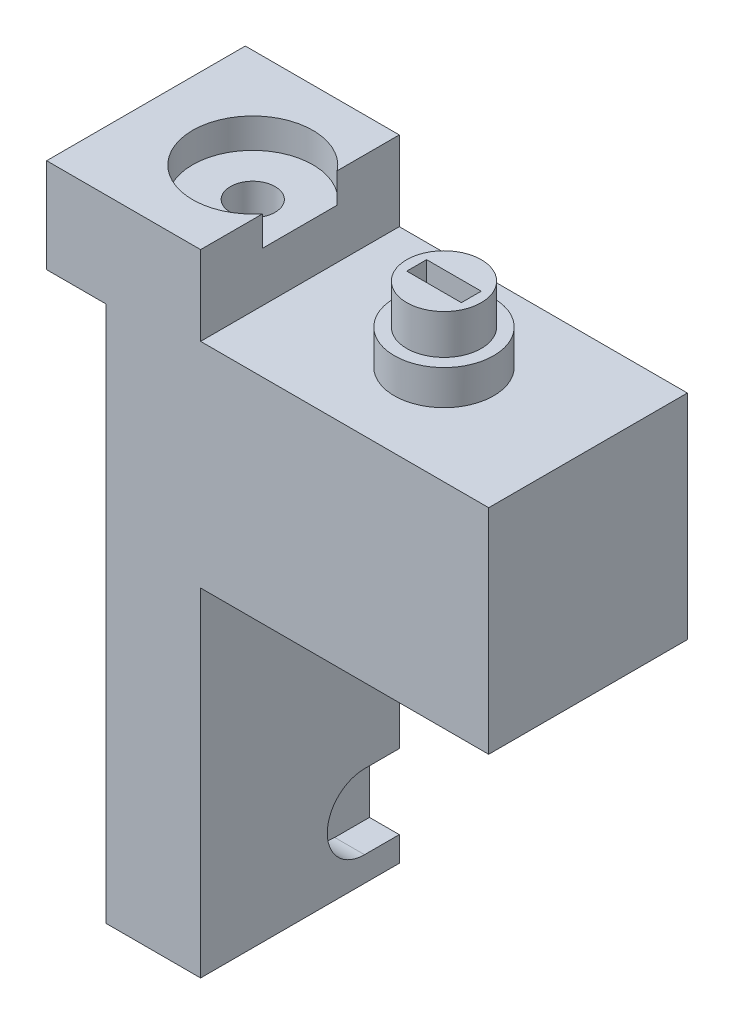
ISO-10303-21;
HEADER;
FILE_DESCRIPTION(('STEP AP214'),'2;1');
FILE_NAME('part.step','',(''),(''),'','','');
FILE_SCHEMA(('AUTOMOTIVE_DESIGN { 1 0 10303 214 1 1 1 1 }'));
ENDSEC;
DATA;
#1=APPLICATION_CONTEXT('core data for automotive mechanical design processes');
#2=APPLICATION_PROTOCOL_DEFINITION('international standard','automotive_design',2000,#1);
#3=PRODUCT_CONTEXT('',#1,'mechanical');
#4=PRODUCT('Part','Part','',(#3));
#5=PRODUCT_RELATED_PRODUCT_CATEGORY('part','',(#4));
#6=PRODUCT_DEFINITION_FORMATION('','',#4);
#7=PRODUCT_DEFINITION_CONTEXT('part definition',#1,'design');
#8=PRODUCT_DEFINITION('design','',#6,#7);
#9=PRODUCT_DEFINITION_SHAPE('','',#8);
#10=(LENGTH_UNIT() NAMED_UNIT(*) SI_UNIT(.MILLI.,.METRE.));
#11=(NAMED_UNIT(*) PLANE_ANGLE_UNIT() SI_UNIT($,.RADIAN.));
#12=(NAMED_UNIT(*) SI_UNIT($,.STERADIAN.) SOLID_ANGLE_UNIT());
#13=UNCERTAINTY_MEASURE_WITH_UNIT(LENGTH_MEASURE(1.E-05),#10,'distance_accuracy_value','');
#14=(GEOMETRIC_REPRESENTATION_CONTEXT(3) GLOBAL_UNCERTAINTY_ASSIGNED_CONTEXT((#13)) GLOBAL_UNIT_ASSIGNED_CONTEXT((#10,
#11,#12)) REPRESENTATION_CONTEXT('',''));
#15=CARTESIAN_POINT('',(0.,0.,0.));
#16=DIRECTION('',(0.,0.,1.));
#17=DIRECTION('',(1.,0.,0.));
#18=AXIS2_PLACEMENT_3D('',#15,#16,#17);
#19=CARTESIAN_POINT('',(12.192,29.972,-5.08));
#20=DIRECTION('',(0.,1.,0.));
#21=DIRECTION('',(0.,0.,1.));
#22=AXIS2_PLACEMENT_3D('',#19,#20,#21);
#23=PLANE('',#22);
#24=CARTESIAN_POINT('',(12.192,29.972,-5.08));
#25=DIRECTION('',(0.,1.,0.));
#26=DIRECTION('',(0.,0.,1.));
#27=AXIS2_PLACEMENT_3D('',#24,#25,#26);
#28=CIRCLE('',#27,2.54);
#29=CARTESIAN_POINT('',(12.192,29.972,-2.54));
#30=VERTEX_POINT('',#29);
#31=EDGE_CURVE('E213',#30,#30,#28,.T.);
#32=ORIENTED_EDGE('',*,*,#31,.T.);
#33=EDGE_LOOP('',(#32));
#34=FACE_BOUND('',#33,.T.);
#35=CARTESIAN_POINT('',(12.192,29.972,-5.08));
#36=DIRECTION('',(0.,1.,0.));
#37=DIRECTION('',(0.,0.,1.));
#38=AXIS2_PLACEMENT_3D('',#35,#36,#37);
#39=CIRCLE('',#38,1.905);
#40=CARTESIAN_POINT('',(12.192,29.972,-3.175));
#41=VERTEX_POINT('',#40);
#42=EDGE_CURVE('E206',#41,#41,#39,.T.);
#43=ORIENTED_EDGE('',*,*,#42,.F.);
#44=EDGE_LOOP('',(#43));
#45=FACE_BOUND('',#44,.T.);
#46=ADVANCED_FACE('F34',(#34,#45),#23,.T.);
#47=CARTESIAN_POINT('',(0.,28.194,-10.16));
#48=DIRECTION('',(0.,-1.,0.));
#49=DIRECTION('',(0.,0.,-1.));
#50=AXIS2_PLACEMENT_3D('',#47,#48,#49);
#51=PLANE('',#50);
#52=DIRECTION('',(1.,0.,0.));
#53=VECTOR('',#52,1.);
#54=CARTESIAN_POINT('',(0.,28.194,0.));
#55=LINE('',#54,#53);
#56=CARTESIAN_POINT('',(4.826,28.194,0.));
#57=VERTEX_POINT('',#56);
#58=CARTESIAN_POINT('',(19.558,28.194,0.));
#59=VERTEX_POINT('',#58);
#60=EDGE_CURVE('E299',#57,#59,#55,.T.);
#61=ORIENTED_EDGE('',*,*,#60,.T.);
#62=DIRECTION('',(0.,0.,1.));
#63=VECTOR('',#62,1.);
#64=CARTESIAN_POINT('',(19.558,28.194,-10.16));
#65=LINE('',#64,#63);
#66=CARTESIAN_POINT('',(19.558,28.194,-10.16));
#67=VERTEX_POINT('',#66);
#68=EDGE_CURVE('E337',#67,#59,#65,.T.);
#69=ORIENTED_EDGE('',*,*,#68,.F.);
#70=DIRECTION('',(1.,0.,0.));
#71=VECTOR('',#70,1.);
#72=CARTESIAN_POINT('',(0.,28.194,-10.16));
#73=LINE('',#72,#71);
#74=CARTESIAN_POINT('',(4.826,28.194,-10.16));
#75=VERTEX_POINT('',#74);
#76=EDGE_CURVE('E272',#75,#67,#73,.T.);
#77=ORIENTED_EDGE('',*,*,#76,.F.);
#78=DIRECTION('',(0.,0.,1.));
#79=VECTOR('',#78,1.);
#80=CARTESIAN_POINT('',(4.826,28.194,-10.16));
#81=LINE('',#80,#79);
#82=EDGE_CURVE('E335',#75,#57,#81,.T.);
#83=ORIENTED_EDGE('',*,*,#82,.T.);
#84=EDGE_LOOP('',(#61,#69,#77,#83));
#85=FACE_BOUND('',#84,.T.);
#86=CARTESIAN_POINT('',(12.192,28.194,-5.08));
#87=DIRECTION('',(0.,-1.,0.));
#88=DIRECTION('',(0.,0.,-1.));
#89=AXIS2_PLACEMENT_3D('',#86,#87,#88);
#90=CIRCLE('',#89,2.54);
#91=CARTESIAN_POINT('',(12.192,28.194,-7.62));
#92=VERTEX_POINT('',#91);
#93=EDGE_CURVE('E11',#92,#92,#90,.F.);
#94=ORIENTED_EDGE('',*,*,#93,.F.);
#95=EDGE_LOOP('',(#94));
#96=FACE_BOUND('',#95,.T.);
#97=ADVANCED_FACE('F393',(#85,#96),#51,.F.);
#98=CARTESIAN_POINT('',(2.413,32.258,-5.08));
#99=DIRECTION('',(0.,-1.,0.));
#100=DIRECTION('',(0.,0.,-1.));
#101=AXIS2_PLACEMENT_3D('',#98,#99,#100);
#102=CYLINDRICAL_SURFACE('',#101,1.143);
#103=CARTESIAN_POINT('',(2.413,0.,-5.08));
#104=DIRECTION('',(0.,-1.,0.));
#105=DIRECTION('',(0.,0.,-1.));
#106=AXIS2_PLACEMENT_3D('',#103,#104,#105);
#107=CIRCLE('',#106,1.143);
#108=CARTESIAN_POINT('',(2.413,0.,-6.223));
#109=VERTEX_POINT('',#108);
#110=EDGE_CURVE('E261',#109,#109,#107,.T.);
#111=ORIENTED_EDGE('',*,*,#110,.T.);
#112=EDGE_LOOP('',(#111));
#113=FACE_BOUND('',#112,.T.);
#114=CARTESIAN_POINT('',(2.413,30.734,-5.08));
#115=DIRECTION('',(0.,1.,0.));
#116=DIRECTION('',(0.,0.,1.));
#117=AXIS2_PLACEMENT_3D('',#114,#115,#116);
#118=CIRCLE('',#117,1.143);
#119=CARTESIAN_POINT('',(2.413,30.734,-3.937));
#120=VERTEX_POINT('',#119);
#121=EDGE_CURVE('E219',#120,#120,#118,.F.);
#122=ORIENTED_EDGE('',*,*,#121,.F.);
#123=EDGE_LOOP('',(#122));
#124=FACE_BOUND('',#123,.T.);
#125=ADVANCED_FACE('F399',(#113,#124),#102,.F.);
#126=CARTESIAN_POINT('',(4.826,0.,-10.16));
#127=DIRECTION('',(1.,0.,0.));
#128=DIRECTION('',(0.,0.,-1.));
#129=AXIS2_PLACEMENT_3D('',#126,#127,#128);
#130=PLANE('',#129);
#131=DIRECTION('',(0.,1.,0.));
#132=VECTOR('',#131,1.);
#133=CARTESIAN_POINT('',(4.826,0.,-10.16));
#134=LINE('',#133,#132);
#135=CARTESIAN_POINT('',(4.826,0.,-10.16));
#136=VERTEX_POINT('',#135);
#137=CARTESIAN_POINT('',(4.826,1.27,-10.16));
#138=VERTEX_POINT('',#137);
#139=EDGE_CURVE('E279',#136,#138,#134,.T.);
#140=ORIENTED_EDGE('',*,*,#139,.T.);
#141=DIRECTION('',(0.,0.,1.));
#142=VECTOR('',#141,1.);
#143=CARTESIAN_POINT('',(4.826,1.27,-10.16));
#144=LINE('',#143,#142);
#145=CARTESIAN_POINT('',(4.826,1.27,-8.382));
#146=VERTEX_POINT('',#145);
#147=EDGE_CURVE('E230',#138,#146,#144,.T.);
#148=ORIENTED_EDGE('',*,*,#147,.T.);
#149=CARTESIAN_POINT('',(4.826,3.175,-8.382));
#150=DIRECTION('',(-1.,0.,0.));
#151=DIRECTION('',(0.,0.,1.));
#152=AXIS2_PLACEMENT_3D('',#149,#150,#151);
#153=CIRCLE('',#152,1.905);
#154=CARTESIAN_POINT('',(4.826,5.08,-8.382));
#155=VERTEX_POINT('',#154);
#156=EDGE_CURVE('E247',#146,#155,#153,.T.);
#157=ORIENTED_EDGE('',*,*,#156,.T.);
#158=DIRECTION('',(0.,0.,1.));
#159=VECTOR('',#158,1.);
#160=CARTESIAN_POINT('',(4.826,5.08,-10.16));
#161=LINE('',#160,#159);
#162=CARTESIAN_POINT('',(4.826,5.08,-10.16));
#163=VERTEX_POINT('',#162);
#164=EDGE_CURVE('E236',#163,#155,#161,.T.);
#165=ORIENTED_EDGE('',*,*,#164,.F.);
#166=CARTESIAN_POINT('',(4.826,17.272,-10.16));
#167=VERTEX_POINT('',#166);
#168=EDGE_CURVE('E278',#163,#167,#134,.T.);
#169=ORIENTED_EDGE('',*,*,#168,.T.);
#170=DIRECTION('',(0.,0.,1.));
#171=VECTOR('',#170,1.);
#172=CARTESIAN_POINT('',(4.826,17.272,-10.16));
#173=LINE('',#172,#171);
#174=CARTESIAN_POINT('',(4.826,17.272,0.));
#175=VERTEX_POINT('',#174);
#176=EDGE_CURVE('E42',#167,#175,#173,.T.);
#177=ORIENTED_EDGE('',*,*,#176,.T.);
#178=DIRECTION('',(0.,1.,0.));
#179=VECTOR('',#178,1.);
#180=CARTESIAN_POINT('',(4.826,0.,0.));
#181=LINE('',#180,#179);
#182=CARTESIAN_POINT('',(4.826,0.,0.));
#183=VERTEX_POINT('',#182);
#184=EDGE_CURVE('E269',#183,#175,#181,.T.);
#185=ORIENTED_EDGE('',*,*,#184,.F.);
#186=DIRECTION('',(0.,0.,1.));
#187=VECTOR('',#186,1.);
#188=CARTESIAN_POINT('',(4.826,0.,-10.16));
#189=LINE('',#188,#187);
#190=EDGE_CURVE('E321',#136,#183,#189,.T.);
#191=ORIENTED_EDGE('',*,*,#190,.F.);
#192=EDGE_LOOP('',(#140,#148,#157,#165,#169,#177,#185,#191));
#193=FACE_BOUND('',#192,.T.);
#194=ADVANCED_FACE('F348',(#193),#130,.T.);
#195=CARTESIAN_POINT('',(0.,0.,-10.16));
#196=DIRECTION('',(0.,0.,1.));
#197=DIRECTION('',(1.,0.,0.));
#198=AXIS2_PLACEMENT_3D('',#195,#196,#197);
#199=PLANE('',#198);
#200=DIRECTION('',(1.,0.,0.));
#201=VECTOR('',#200,1.);
#202=CARTESIAN_POINT('',(3.302,1.27,-10.16));
#203=LINE('',#202,#201);
#204=CARTESIAN_POINT('',(3.302,1.27,-10.16));
#205=VERTEX_POINT('',#204);
#206=EDGE_CURVE('E244',#205,#138,#203,.T.);
#207=ORIENTED_EDGE('',*,*,#206,.T.);
#208=ORIENTED_EDGE('',*,*,#139,.F.);
#209=DIRECTION('',(1.,0.,0.));
#210=VECTOR('',#209,1.);
#211=CARTESIAN_POINT('',(0.,0.,-10.16));
#212=LINE('',#211,#210);
#213=CARTESIAN_POINT('',(0.,0.,-10.16));
#214=VERTEX_POINT('',#213);
#215=EDGE_CURVE('E291',#214,#136,#212,.T.);
#216=ORIENTED_EDGE('',*,*,#215,.F.);
#217=DIRECTION('',(0.,-1.,0.));
#218=VECTOR('',#217,1.);
#219=CARTESIAN_POINT('',(0.,0.,-10.16));
#220=LINE('',#219,#218);
#221=CARTESIAN_POINT('',(0.,27.432,-10.16));
#222=VERTEX_POINT('',#221);
#223=EDGE_CURVE('E288',#222,#214,#220,.T.);
#224=ORIENTED_EDGE('',*,*,#223,.F.);
#225=DIRECTION('',(1.,0.,0.));
#226=VECTOR('',#225,1.);
#227=CARTESIAN_POINT('',(0.,27.432,-10.16));
#228=LINE('',#227,#226);
#229=CARTESIAN_POINT('',(-3.048,27.432,-10.16));
#230=VERTEX_POINT('',#229);
#231=EDGE_CURVE('E285',#230,#222,#228,.T.);
#232=ORIENTED_EDGE('',*,*,#231,.F.);
#233=DIRECTION('',(0.,-1.,0.));
#234=VECTOR('',#233,1.);
#235=CARTESIAN_POINT('',(-3.04799999999999,0.,-10.16));
#236=LINE('',#235,#234);
#237=CARTESIAN_POINT('',(-3.048,32.258,-10.16));
#238=VERTEX_POINT('',#237);
#239=EDGE_CURVE('E282',#238,#230,#236,.T.);
#240=ORIENTED_EDGE('',*,*,#239,.F.);
#241=DIRECTION('',(-1.,0.,0.));
#242=VECTOR('',#241,1.);
#243=CARTESIAN_POINT('',(0.,32.258,-10.16));
#244=LINE('',#243,#242);
#245=CARTESIAN_POINT('',(4.826,32.258,-10.16));
#246=VERTEX_POINT('',#245);
#247=EDGE_CURVE('E277',#246,#238,#244,.T.);
#248=ORIENTED_EDGE('',*,*,#247,.F.);
#249=EDGE_CURVE('E274',#75,#246,#134,.T.);
#250=ORIENTED_EDGE('',*,*,#249,.F.);
#251=ORIENTED_EDGE('',*,*,#76,.T.);
#252=DIRECTION('',(0.,1.,0.));
#253=VECTOR('',#252,1.);
#254=CARTESIAN_POINT('',(19.558,0.,-10.16));
#255=LINE('',#254,#253);
#256=CARTESIAN_POINT('',(19.558,17.272,-10.16));
#257=VERTEX_POINT('',#256);
#258=EDGE_CURVE('E268',#257,#67,#255,.T.);
#259=ORIENTED_EDGE('',*,*,#258,.F.);
#260=DIRECTION('',(1.,0.,0.));
#261=VECTOR('',#260,1.);
#262=CARTESIAN_POINT('',(0.,17.272,-10.16));
#263=LINE('',#262,#261);
#264=EDGE_CURVE('E265',#167,#257,#263,.T.);
#265=ORIENTED_EDGE('',*,*,#264,.F.);
#266=ORIENTED_EDGE('',*,*,#168,.F.);
#267=DIRECTION('',(1.,0.,0.));
#268=VECTOR('',#267,1.);
#269=CARTESIAN_POINT('',(3.302,5.08,-10.16));
#270=LINE('',#269,#268);
#271=CARTESIAN_POINT('',(3.302,5.08,-10.16));
#272=VERTEX_POINT('',#271);
#273=EDGE_CURVE('E254',#272,#163,#270,.T.);
#274=ORIENTED_EDGE('',*,*,#273,.F.);
#275=DIRECTION('',(0.,1.,0.));
#276=VECTOR('',#275,1.);
#277=CARTESIAN_POINT('',(3.302,1.27,-10.16));
#278=LINE('',#277,#276);
#279=EDGE_CURVE('E241',#205,#272,#278,.T.);
#280=ORIENTED_EDGE('',*,*,#279,.F.);
#281=EDGE_LOOP('',(#207,#208,#216,#224,#232,#240,#248,#250,#251,#259,#265,#266,#274,#280));
#282=FACE_BOUND('',#281,.T.);
#283=ADVANCED_FACE('F355',(#282),#199,.F.);
#284=CARTESIAN_POINT('',(0.,17.272,-10.16));
#285=DIRECTION('',(0.,-1.,0.));
#286=DIRECTION('',(0.,0.,-1.));
#287=AXIS2_PLACEMENT_3D('',#284,#285,#286);
#288=PLANE('',#287);
#289=DIRECTION('',(1.,0.,0.));
#290=VECTOR('',#289,1.);
#291=CARTESIAN_POINT('',(0.,17.272,0.));
#292=LINE('',#291,#290);
#293=CARTESIAN_POINT('',(19.558,17.272,0.));
#294=VERTEX_POINT('',#293);
#295=EDGE_CURVE('E264',#175,#294,#292,.T.);
#296=ORIENTED_EDGE('',*,*,#295,.F.);
#297=ORIENTED_EDGE('',*,*,#176,.F.);
#298=ORIENTED_EDGE('',*,*,#264,.T.);
#299=DIRECTION('',(0.,0.,1.));
#300=VECTOR('',#299,1.);
#301=CARTESIAN_POINT('',(19.558,17.272,-10.16));
#302=LINE('',#301,#300);
#303=EDGE_CURVE('E338',#257,#294,#302,.T.);
#304=ORIENTED_EDGE('',*,*,#303,.T.);
#305=EDGE_LOOP('',(#296,#297,#298,#304));
#306=FACE_BOUND('',#305,.T.);
#307=ADVANCED_FACE('F36',(#306),#288,.T.);
#308=CARTESIAN_POINT('',(0.,0.,-10.16));
#309=DIRECTION('',(0.,-1.,0.));
#310=DIRECTION('',(0.,0.,-1.));
#311=AXIS2_PLACEMENT_3D('',#308,#309,#310);
#312=PLANE('',#311);
#313=ORIENTED_EDGE('',*,*,#110,.F.);
#314=EDGE_LOOP('',(#313));
#315=FACE_BOUND('',#314,.T.);
#316=DIRECTION('',(1.,0.,0.));
#317=VECTOR('',#316,1.);
#318=CARTESIAN_POINT('',(0.,0.,0.));
#319=LINE('',#318,#317);
#320=CARTESIAN_POINT('',(0.,0.,0.));
#321=VERTEX_POINT('',#320);
#322=EDGE_CURVE('E317',#321,#183,#319,.T.);
#323=ORIENTED_EDGE('',*,*,#322,.F.);
#324=DIRECTION('',(0.,0.,1.));
#325=VECTOR('',#324,1.);
#326=CARTESIAN_POINT('',(0.,0.,-10.16));
#327=LINE('',#326,#325);
#328=EDGE_CURVE('E323',#214,#321,#327,.T.);
#329=ORIENTED_EDGE('',*,*,#328,.F.);
#330=ORIENTED_EDGE('',*,*,#215,.T.);
#331=ORIENTED_EDGE('',*,*,#190,.T.);
#332=EDGE_LOOP('',(#323,#329,#330,#331));
#333=FACE_BOUND('',#332,.T.);
#334=ADVANCED_FACE('F367',(#315,#333),#312,.T.);
#335=CARTESIAN_POINT('',(0.,0.,-10.16));
#336=DIRECTION('',(-1.,0.,0.));
#337=DIRECTION('',(0.,0.,1.));
#338=AXIS2_PLACEMENT_3D('',#335,#336,#337);
#339=PLANE('',#338);
#340=DIRECTION('',(0.,-1.,0.));
#341=VECTOR('',#340,1.);
#342=CARTESIAN_POINT('',(0.,0.,0.));
#343=LINE('',#342,#341);
#344=CARTESIAN_POINT('',(0.,27.432,0.));
#345=VERTEX_POINT('',#344);
#346=EDGE_CURVE('E314',#345,#321,#343,.T.);
#347=ORIENTED_EDGE('',*,*,#346,.F.);
#348=DIRECTION('',(0.,0.,1.));
#349=VECTOR('',#348,1.);
#350=CARTESIAN_POINT('',(0.,27.432,-10.16));
#351=LINE('',#350,#349);
#352=EDGE_CURVE('E325',#222,#345,#351,.T.);
#353=ORIENTED_EDGE('',*,*,#352,.F.);
#354=ORIENTED_EDGE('',*,*,#223,.T.);
#355=ORIENTED_EDGE('',*,*,#328,.T.);
#356=EDGE_LOOP('',(#347,#353,#354,#355));
#357=FACE_BOUND('',#356,.T.);
#358=ADVANCED_FACE('F440',(#357),#339,.T.);
#359=CARTESIAN_POINT('',(0.,27.432,-10.16));
#360=DIRECTION('',(0.,-1.,0.));
#361=DIRECTION('',(0.,0.,-1.));
#362=AXIS2_PLACEMENT_3D('',#359,#360,#361);
#363=PLANE('',#362);
#364=DIRECTION('',(1.,0.,0.));
#365=VECTOR('',#364,1.);
#366=CARTESIAN_POINT('',(0.,27.432,0.));
#367=LINE('',#366,#365);
#368=CARTESIAN_POINT('',(-3.048,27.432,0.));
#369=VERTEX_POINT('',#368);
#370=EDGE_CURVE('E311',#369,#345,#367,.T.);
#371=ORIENTED_EDGE('',*,*,#370,.F.);
#372=DIRECTION('',(0.,0.,1.));
#373=VECTOR('',#372,1.);
#374=CARTESIAN_POINT('',(-3.048,27.432,-10.16));
#375=LINE('',#374,#373);
#376=EDGE_CURVE('E327',#230,#369,#375,.T.);
#377=ORIENTED_EDGE('',*,*,#376,.F.);
#378=ORIENTED_EDGE('',*,*,#231,.T.);
#379=ORIENTED_EDGE('',*,*,#352,.T.);
#380=EDGE_LOOP('',(#371,#377,#378,#379));
#381=FACE_BOUND('',#380,.T.);
#382=ADVANCED_FACE('F438',(#381),#363,.T.);
#383=CARTESIAN_POINT('',(-3.04799999999999,0.,-10.16));
#384=DIRECTION('',(-1.,0.,0.));
#385=DIRECTION('',(0.,-1.,0.));
#386=AXIS2_PLACEMENT_3D('',#383,#384,#385);
#387=PLANE('',#386);
#388=DIRECTION('',(0.,-1.,0.));
#389=VECTOR('',#388,1.);
#390=CARTESIAN_POINT('',(-3.04799999999999,0.,0.));
#391=LINE('',#390,#389);
#392=CARTESIAN_POINT('',(-3.048,32.258,0.));
#393=VERTEX_POINT('',#392);
#394=EDGE_CURVE('E308',#393,#369,#391,.T.);
#395=ORIENTED_EDGE('',*,*,#394,.F.);
#396=DIRECTION('',(0.,0.,1.));
#397=VECTOR('',#396,1.);
#398=CARTESIAN_POINT('',(-3.048,32.258,-10.16));
#399=LINE('',#398,#397);
#400=EDGE_CURVE('E329',#238,#393,#399,.T.);
#401=ORIENTED_EDGE('',*,*,#400,.F.);
#402=ORIENTED_EDGE('',*,*,#239,.T.);
#403=ORIENTED_EDGE('',*,*,#376,.T.);
#404=EDGE_LOOP('',(#395,#401,#402,#403));
#405=FACE_BOUND('',#404,.T.);
#406=ADVANCED_FACE('F429',(#405),#387,.T.);
#407=CARTESIAN_POINT('',(0.,32.258,-10.16));
#408=DIRECTION('',(0.,1.,0.));
#409=DIRECTION('',(0.,0.,1.));
#410=AXIS2_PLACEMENT_3D('',#407,#408,#409);
#411=PLANE('',#410);
#412=CARTESIAN_POINT('',(2.413,32.258,-5.08));
#413=DIRECTION('',(0.,1.,0.));
#414=DIRECTION('',(0.,0.,1.));
#415=AXIS2_PLACEMENT_3D('',#412,#413,#414);
#416=CIRCLE('',#415,3.07434448297519);
#417=CARTESIAN_POINT('',(4.826,32.258,-6.985));
#418=VERTEX_POINT('',#417);
#419=CARTESIAN_POINT('',(4.826,32.258,-3.175));
#420=VERTEX_POINT('',#419);
#421=EDGE_CURVE('E218',#418,#420,#416,.T.);
#422=ORIENTED_EDGE('',*,*,#421,.F.);
#423=DIRECTION('',(0.,0.,1.));
#424=VECTOR('',#423,1.);
#425=CARTESIAN_POINT('',(4.826,32.258,-10.16));
#426=LINE('',#425,#424);
#427=EDGE_CURVE('E331',#246,#418,#426,.T.);
#428=ORIENTED_EDGE('',*,*,#427,.F.);
#429=ORIENTED_EDGE('',*,*,#247,.T.);
#430=ORIENTED_EDGE('',*,*,#400,.T.);
#431=DIRECTION('',(-1.,0.,0.));
#432=VECTOR('',#431,1.);
#433=CARTESIAN_POINT('',(0.,32.258,0.));
#434=LINE('',#433,#432);
#435=CARTESIAN_POINT('',(4.826,32.258,0.));
#436=VERTEX_POINT('',#435);
#437=EDGE_CURVE('E305',#436,#393,#434,.T.);
#438=ORIENTED_EDGE('',*,*,#437,.F.);
#439=EDGE_CURVE('E334',#420,#436,#426,.T.);
#440=ORIENTED_EDGE('',*,*,#439,.F.);
#441=EDGE_LOOP('',(#422,#428,#429,#430,#438,#440));
#442=FACE_BOUND('',#441,.T.);
#443=ADVANCED_FACE('F423',(#442),#411,.T.);
#444=DIRECTION('',(0.,1.,0.));
#445=VECTOR('',#444,1.);
#446=CARTESIAN_POINT('',(4.826,30.734,-6.985));
#447=LINE('',#446,#445);
#448=CARTESIAN_POINT('',(4.826,30.734,-6.985));
#449=VERTEX_POINT('',#448);
#450=EDGE_CURVE('E225',#449,#418,#447,.T.);
#451=ORIENTED_EDGE('',*,*,#450,.F.);
#452=DIRECTION('',(0.,0.,-1.));
#453=VECTOR('',#452,1.);
#454=CARTESIAN_POINT('',(4.826,30.734,0.));
#455=LINE('',#454,#453);
#456=CARTESIAN_POINT('',(4.826,30.734,-3.175));
#457=VERTEX_POINT('',#456);
#458=EDGE_CURVE('E222',#457,#449,#455,.T.);
#459=ORIENTED_EDGE('',*,*,#458,.F.);
#460=DIRECTION('',(0.,1.,0.));
#461=VECTOR('',#460,1.);
#462=CARTESIAN_POINT('',(4.826,30.734,-3.175));
#463=LINE('',#462,#461);
#464=EDGE_CURVE('E227',#457,#420,#463,.T.);
#465=ORIENTED_EDGE('',*,*,#464,.T.);
#466=ORIENTED_EDGE('',*,*,#439,.T.);
#467=EDGE_CURVE('E302',#57,#436,#181,.T.);
#468=ORIENTED_EDGE('',*,*,#467,.F.);
#469=ORIENTED_EDGE('',*,*,#82,.F.);
#470=ORIENTED_EDGE('',*,*,#249,.T.);
#471=ORIENTED_EDGE('',*,*,#427,.T.);
#472=EDGE_LOOP('',(#451,#459,#465,#466,#468,#469,#470,#471));
#473=FACE_BOUND('',#472,.T.);
#474=ADVANCED_FACE('F420',(#473),#130,.T.);
#475=CARTESIAN_POINT('',(19.558,0.,-10.16));
#476=DIRECTION('',(1.,0.,0.));
#477=DIRECTION('',(0.,0.,-1.));
#478=AXIS2_PLACEMENT_3D('',#475,#476,#477);
#479=PLANE('',#478);
#480=DIRECTION('',(0.,1.,0.));
#481=VECTOR('',#480,1.);
#482=CARTESIAN_POINT('',(19.558,0.,0.));
#483=LINE('',#482,#481);
#484=EDGE_CURVE('E296',#294,#59,#483,.T.);
#485=ORIENTED_EDGE('',*,*,#484,.F.);
#486=ORIENTED_EDGE('',*,*,#303,.F.);
#487=ORIENTED_EDGE('',*,*,#258,.T.);
#488=ORIENTED_EDGE('',*,*,#68,.T.);
#489=EDGE_LOOP('',(#485,#486,#487,#488));
#490=FACE_BOUND('',#489,.T.);
#491=ADVANCED_FACE('F360',(#490),#479,.T.);
#492=CARTESIAN_POINT('',(0.,0.,0.));
#493=DIRECTION('',(0.,0.,1.));
#494=DIRECTION('',(1.,0.,0.));
#495=AXIS2_PLACEMENT_3D('',#492,#493,#494);
#496=PLANE('',#495);
#497=ORIENTED_EDGE('',*,*,#295,.T.);
#498=ORIENTED_EDGE('',*,*,#484,.T.);
#499=ORIENTED_EDGE('',*,*,#60,.F.);
#500=ORIENTED_EDGE('',*,*,#467,.T.);
#501=ORIENTED_EDGE('',*,*,#437,.T.);
#502=ORIENTED_EDGE('',*,*,#394,.T.);
#503=ORIENTED_EDGE('',*,*,#370,.T.);
#504=ORIENTED_EDGE('',*,*,#346,.T.);
#505=ORIENTED_EDGE('',*,*,#322,.T.);
#506=ORIENTED_EDGE('',*,*,#184,.T.);
#507=EDGE_LOOP('',(#497,#498,#499,#500,#501,#502,#503,#504,#505,#506));
#508=FACE_BOUND('',#507,.T.);
#509=ADVANCED_FACE('F363',(#508),#496,.T.);
#510=CARTESIAN_POINT('',(3.302,1.27,-10.16));
#511=DIRECTION('',(0.,1.,0.));
#512=DIRECTION('',(0.,0.,1.));
#513=AXIS2_PLACEMENT_3D('',#510,#511,#512);
#514=PLANE('',#513);
#515=ORIENTED_EDGE('',*,*,#147,.F.);
#516=ORIENTED_EDGE('',*,*,#206,.F.);
#517=DIRECTION('',(0.,0.,1.));
#518=VECTOR('',#517,1.);
#519=CARTESIAN_POINT('',(3.302,1.27,-10.16));
#520=LINE('',#519,#518);
#521=CARTESIAN_POINT('',(3.302,1.27,-8.382));
#522=VERTEX_POINT('',#521);
#523=EDGE_CURVE('E232',#205,#522,#520,.T.);
#524=ORIENTED_EDGE('',*,*,#523,.T.);
#525=DIRECTION('',(1.,0.,0.));
#526=VECTOR('',#525,1.);
#527=CARTESIAN_POINT('',(3.302,1.27,-8.382));
#528=LINE('',#527,#526);
#529=EDGE_CURVE('E258',#522,#146,#528,.T.);
#530=ORIENTED_EDGE('',*,*,#529,.T.);
#531=EDGE_LOOP('',(#515,#516,#524,#530));
#532=FACE_BOUND('',#531,.T.);
#533=ADVANCED_FACE('F372',(#532),#514,.T.);
#534=CARTESIAN_POINT('',(3.302,3.175,-8.382));
#535=DIRECTION('',(1.,0.,0.));
#536=DIRECTION('',(0.,0.,-1.));
#537=AXIS2_PLACEMENT_3D('',#534,#535,#536);
#538=CYLINDRICAL_SURFACE('',#537,1.905);
#539=ORIENTED_EDGE('',*,*,#156,.F.);
#540=ORIENTED_EDGE('',*,*,#529,.F.);
#541=CARTESIAN_POINT('',(3.302,3.175,-8.382));
#542=DIRECTION('',(-1.,0.,0.));
#543=DIRECTION('',(0.,0.,1.));
#544=AXIS2_PLACEMENT_3D('',#541,#542,#543);
#545=CIRCLE('',#544,1.905);
#546=CARTESIAN_POINT('',(3.302,5.08,-8.382));
#547=VERTEX_POINT('',#546);
#548=EDGE_CURVE('E235',#522,#547,#545,.T.);
#549=ORIENTED_EDGE('',*,*,#548,.T.);
#550=DIRECTION('',(1.,0.,0.));
#551=VECTOR('',#550,1.);
#552=CARTESIAN_POINT('',(3.302,5.08,-8.382));
#553=LINE('',#552,#551);
#554=EDGE_CURVE('E256',#547,#155,#553,.T.);
#555=ORIENTED_EDGE('',*,*,#554,.T.);
#556=EDGE_LOOP('',(#539,#540,#549,#555));
#557=FACE_BOUND('',#556,.T.);
#558=ADVANCED_FACE('F375',(#557),#538,.F.);
#559=CARTESIAN_POINT('',(3.302,5.08,-10.16));
#560=DIRECTION('',(0.,1.,0.));
#561=DIRECTION('',(0.,0.,1.));
#562=AXIS2_PLACEMENT_3D('',#559,#560,#561);
#563=PLANE('',#562);
#564=ORIENTED_EDGE('',*,*,#164,.T.);
#565=ORIENTED_EDGE('',*,*,#554,.F.);
#566=DIRECTION('',(0.,0.,1.));
#567=VECTOR('',#566,1.);
#568=CARTESIAN_POINT('',(3.302,5.08,-10.16));
#569=LINE('',#568,#567);
#570=EDGE_CURVE('E238',#272,#547,#569,.T.);
#571=ORIENTED_EDGE('',*,*,#570,.F.);
#572=ORIENTED_EDGE('',*,*,#273,.T.);
#573=EDGE_LOOP('',(#564,#565,#571,#572));
#574=FACE_BOUND('',#573,.T.);
#575=ADVANCED_FACE('F378',(#574),#563,.F.);
#576=CARTESIAN_POINT('',(3.302,3.175,-8.382));
#577=DIRECTION('',(-1.,0.,0.));
#578=DIRECTION('',(0.,0.,1.));
#579=AXIS2_PLACEMENT_3D('',#576,#577,#578);
#580=PLANE('',#579);
#581=ORIENTED_EDGE('',*,*,#523,.F.);
#582=ORIENTED_EDGE('',*,*,#279,.T.);
#583=ORIENTED_EDGE('',*,*,#570,.T.);
#584=ORIENTED_EDGE('',*,*,#548,.F.);
#585=EDGE_LOOP('',(#581,#582,#583,#584));
#586=FACE_BOUND('',#585,.T.);
#587=ADVANCED_FACE('F380',(#586),#580,.F.);
#588=CARTESIAN_POINT('',(2.413,30.734,-5.08));
#589=DIRECTION('',(0.,1.,0.));
#590=DIRECTION('',(0.,0.,1.));
#591=AXIS2_PLACEMENT_3D('',#588,#589,#590);
#592=CYLINDRICAL_SURFACE('',#591,3.07434448297519);
#593=ORIENTED_EDGE('',*,*,#421,.T.);
#594=ORIENTED_EDGE('',*,*,#464,.F.);
#595=CARTESIAN_POINT('',(2.413,30.734,-5.08));
#596=DIRECTION('',(0.,1.,0.));
#597=DIRECTION('',(0.,0.,1.));
#598=AXIS2_PLACEMENT_3D('',#595,#596,#597);
#599=CIRCLE('',#598,3.07434448297519);
#600=EDGE_CURVE('E56',#449,#457,#599,.T.);
#601=ORIENTED_EDGE('',*,*,#600,.F.);
#602=ORIENTED_EDGE('',*,*,#450,.T.);
#603=EDGE_LOOP('',(#593,#594,#601,#602));
#604=FACE_BOUND('',#603,.T.);
#605=ADVANCED_FACE('F382',(#604),#592,.F.);
#606=CARTESIAN_POINT('',(0.,30.734,0.));
#607=DIRECTION('',(0.,1.,0.));
#608=DIRECTION('',(0.,0.,1.));
#609=AXIS2_PLACEMENT_3D('',#606,#607,#608);
#610=PLANE('',#609);
#611=ORIENTED_EDGE('',*,*,#121,.T.);
#612=EDGE_LOOP('',(#611));
#613=FACE_BOUND('',#612,.T.);
#614=ORIENTED_EDGE('',*,*,#458,.T.);
#615=ORIENTED_EDGE('',*,*,#600,.T.);
#616=EDGE_LOOP('',(#614,#615));
#617=FACE_BOUND('',#616,.T.);
#618=ADVANCED_FACE('F388',(#613,#617),#610,.T.);
#619=CARTESIAN_POINT('',(12.192,29.972,-5.08));
#620=DIRECTION('',(0.,-1.,0.));
#621=DIRECTION('',(0.,0.,-1.));
#622=AXIS2_PLACEMENT_3D('',#619,#620,#621);
#623=CYLINDRICAL_SURFACE('',#622,2.54);
#624=ORIENTED_EDGE('',*,*,#31,.F.);
#625=EDGE_LOOP('',(#624));
#626=FACE_BOUND('',#625,.T.);
#627=ORIENTED_EDGE('',*,*,#93,.T.);
#628=EDGE_LOOP('',(#627));
#629=FACE_BOUND('',#628,.T.);
#630=ADVANCED_FACE('F407',(#626,#629),#623,.T.);
#631=CARTESIAN_POINT('',(12.192,32.004,-5.08));
#632=DIRECTION('',(0.,-1.,0.));
#633=DIRECTION('',(0.,0.,-1.));
#634=AXIS2_PLACEMENT_3D('',#631,#632,#633);
#635=CYLINDRICAL_SURFACE('',#634,1.905);
#636=CARTESIAN_POINT('',(12.192,32.004,-5.08));
#637=DIRECTION('',(0.,1.,0.));
#638=DIRECTION('',(0.,0.,1.));
#639=AXIS2_PLACEMENT_3D('',#636,#637,#638);
#640=CIRCLE('',#639,1.905);
#641=CARTESIAN_POINT('',(12.192,32.004,-3.175));
#642=VERTEX_POINT('',#641);
#643=EDGE_CURVE('E210',#642,#642,#640,.T.);
#644=ORIENTED_EDGE('',*,*,#643,.F.);
#645=EDGE_LOOP('',(#644));
#646=FACE_BOUND('',#645,.T.);
#647=ORIENTED_EDGE('',*,*,#42,.T.);
#648=EDGE_LOOP('',(#647));
#649=FACE_BOUND('',#648,.T.);
#650=ADVANCED_FACE('F405',(#646,#649),#635,.T.);
#651=CARTESIAN_POINT('',(12.192,32.004,-5.08));
#652=DIRECTION('',(0.,1.,0.));
#653=DIRECTION('',(0.,0.,1.));
#654=AXIS2_PLACEMENT_3D('',#651,#652,#653);
#655=PLANE('',#654);
#656=DIRECTION('',(0.,0.,1.));
#657=VECTOR('',#656,1.);
#658=CARTESIAN_POINT('',(10.795,32.004,-4.572));
#659=LINE('',#658,#657);
#660=CARTESIAN_POINT('',(10.795,32.004,-5.588));
#661=VERTEX_POINT('',#660);
#662=CARTESIAN_POINT('',(10.795,32.004,-4.572));
#663=VERTEX_POINT('',#662);
#664=EDGE_CURVE('E49',#661,#663,#659,.T.);
#665=ORIENTED_EDGE('',*,*,#664,.F.);
#666=DIRECTION('',(-1.,0.,0.));
#667=VECTOR('',#666,1.);
#668=CARTESIAN_POINT('',(10.795,32.004,-5.588));
#669=LINE('',#668,#667);
#670=CARTESIAN_POINT('',(13.589,32.004,-5.588));
#671=VERTEX_POINT('',#670);
#672=EDGE_CURVE('E191',#671,#661,#669,.T.);
#673=ORIENTED_EDGE('',*,*,#672,.F.);
#674=DIRECTION('',(0.,0.,-1.));
#675=VECTOR('',#674,1.);
#676=CARTESIAN_POINT('',(13.589,32.004,-4.572));
#677=LINE('',#676,#675);
#678=CARTESIAN_POINT('',(13.589,32.004,-4.572));
#679=VERTEX_POINT('',#678);
#680=EDGE_CURVE('E194',#679,#671,#677,.T.);
#681=ORIENTED_EDGE('',*,*,#680,.F.);
#682=DIRECTION('',(1.,0.,0.));
#683=VECTOR('',#682,1.);
#684=CARTESIAN_POINT('',(10.795,32.004,-4.572));
#685=LINE('',#684,#683);
#686=EDGE_CURVE('E200',#663,#679,#685,.T.);
#687=ORIENTED_EDGE('',*,*,#686,.F.);
#688=EDGE_LOOP('',(#665,#673,#681,#687));
#689=FACE_BOUND('',#688,.T.);
#690=ORIENTED_EDGE('',*,*,#643,.T.);
#691=EDGE_LOOP('',(#690));
#692=FACE_BOUND('',#691,.T.);
#693=ADVANCED_FACE('F541',(#689,#692),#655,.T.);
#694=CARTESIAN_POINT('',(10.795,29.972,-4.572));
#695=DIRECTION('',(-1.,0.,0.));
#696=DIRECTION('',(0.,0.,1.));
#697=AXIS2_PLACEMENT_3D('',#694,#695,#696);
#698=PLANE('',#697);
#699=ORIENTED_EDGE('',*,*,#664,.T.);
#700=DIRECTION('',(0.,1.,0.));
#701=VECTOR('',#700,1.);
#702=CARTESIAN_POINT('',(10.795,29.972,-4.572));
#703=LINE('',#702,#701);
#704=CARTESIAN_POINT('',(10.795,29.972,-4.572));
#705=VERTEX_POINT('',#704);
#706=EDGE_CURVE('E169',#705,#663,#703,.T.);
#707=ORIENTED_EDGE('',*,*,#706,.F.);
#708=DIRECTION('',(0.,0.,1.));
#709=VECTOR('',#708,1.);
#710=CARTESIAN_POINT('',(10.795,29.972,-4.572));
#711=LINE('',#710,#709);
#712=CARTESIAN_POINT('',(10.795,29.972,-5.588));
#713=VERTEX_POINT('',#712);
#714=EDGE_CURVE('E173',#713,#705,#711,.T.);
#715=ORIENTED_EDGE('',*,*,#714,.F.);
#716=DIRECTION('',(0.,1.,0.));
#717=VECTOR('',#716,1.);
#718=CARTESIAN_POINT('',(10.795,29.972,-5.588));
#719=LINE('',#718,#717);
#720=EDGE_CURVE('E204',#713,#661,#719,.T.);
#721=ORIENTED_EDGE('',*,*,#720,.T.);
#722=EDGE_LOOP('',(#699,#707,#715,#721));
#723=FACE_BOUND('',#722,.T.);
#724=ADVANCED_FACE('F171',(#723),#698,.F.);
#725=CARTESIAN_POINT('',(10.795,29.972,-5.588));
#726=DIRECTION('',(0.,0.,-1.));
#727=DIRECTION('',(-1.,0.,0.));
#728=AXIS2_PLACEMENT_3D('',#725,#726,#727);
#729=PLANE('',#728);
#730=ORIENTED_EDGE('',*,*,#672,.T.);
#731=ORIENTED_EDGE('',*,*,#720,.F.);
#732=DIRECTION('',(-1.,0.,0.));
#733=VECTOR('',#732,1.);
#734=CARTESIAN_POINT('',(10.795,29.972,-5.588));
#735=LINE('',#734,#733);
#736=CARTESIAN_POINT('',(13.589,29.972,-5.588));
#737=VERTEX_POINT('',#736);
#738=EDGE_CURVE('E179',#737,#713,#735,.T.);
#739=ORIENTED_EDGE('',*,*,#738,.F.);
#740=DIRECTION('',(0.,1.,0.));
#741=VECTOR('',#740,1.);
#742=CARTESIAN_POINT('',(13.589,29.972,-5.588));
#743=LINE('',#742,#741);
#744=EDGE_CURVE('E207',#737,#671,#743,.T.);
#745=ORIENTED_EDGE('',*,*,#744,.T.);
#746=EDGE_LOOP('',(#730,#731,#739,#745));
#747=FACE_BOUND('',#746,.T.);
#748=ADVANCED_FACE('F558',(#747),#729,.F.);
#749=CARTESIAN_POINT('',(13.589,29.972,-4.572));
#750=DIRECTION('',(1.,0.,0.));
#751=DIRECTION('',(0.,0.,-1.));
#752=AXIS2_PLACEMENT_3D('',#749,#750,#751);
#753=PLANE('',#752);
#754=ORIENTED_EDGE('',*,*,#680,.T.);
#755=ORIENTED_EDGE('',*,*,#744,.F.);
#756=DIRECTION('',(0.,0.,-1.));
#757=VECTOR('',#756,1.);
#758=CARTESIAN_POINT('',(13.589,29.972,-4.572));
#759=LINE('',#758,#757);
#760=CARTESIAN_POINT('',(13.589,29.972,-4.572));
#761=VERTEX_POINT('',#760);
#762=EDGE_CURVE('E187',#761,#737,#759,.T.);
#763=ORIENTED_EDGE('',*,*,#762,.F.);
#764=DIRECTION('',(0.,1.,0.));
#765=VECTOR('',#764,1.);
#766=CARTESIAN_POINT('',(13.589,29.972,-4.572));
#767=LINE('',#766,#765);
#768=EDGE_CURVE('E178',#761,#679,#767,.T.);
#769=ORIENTED_EDGE('',*,*,#768,.T.);
#770=EDGE_LOOP('',(#754,#755,#763,#769));
#771=FACE_BOUND('',#770,.T.);
#772=ADVANCED_FACE('F567',(#771),#753,.F.);
#773=CARTESIAN_POINT('',(10.795,29.972,-4.572));
#774=DIRECTION('',(0.,0.,1.));
#775=DIRECTION('',(1.,0.,0.));
#776=AXIS2_PLACEMENT_3D('',#773,#774,#775);
#777=PLANE('',#776);
#778=ORIENTED_EDGE('',*,*,#686,.T.);
#779=ORIENTED_EDGE('',*,*,#768,.F.);
#780=DIRECTION('',(1.,0.,0.));
#781=VECTOR('',#780,1.);
#782=CARTESIAN_POINT('',(10.795,29.972,-4.572));
#783=LINE('',#782,#781);
#784=EDGE_CURVE('E182',#705,#761,#783,.T.);
#785=ORIENTED_EDGE('',*,*,#784,.F.);
#786=ORIENTED_EDGE('',*,*,#706,.T.);
#787=EDGE_LOOP('',(#778,#779,#785,#786));
#788=FACE_BOUND('',#787,.T.);
#789=ADVANCED_FACE('F183',(#788),#777,.F.);
#790=CARTESIAN_POINT('',(0.,29.972,0.));
#791=DIRECTION('',(0.,-1.,0.));
#792=DIRECTION('',(0.,0.,-1.));
#793=AXIS2_PLACEMENT_3D('',#790,#791,#792);
#794=PLANE('',#793);
#795=ORIENTED_EDGE('',*,*,#714,.T.);
#796=ORIENTED_EDGE('',*,*,#784,.T.);
#797=ORIENTED_EDGE('',*,*,#762,.T.);
#798=ORIENTED_EDGE('',*,*,#738,.T.);
#799=EDGE_LOOP('',(#795,#796,#797,#798));
#800=FACE_BOUND('',#799,.T.);
#801=ADVANCED_FACE('F189',(#800),#794,.F.);
#802=CLOSED_SHELL('',(#46,#97,#125,#194,#283,#307,#334,#358,#382,#406,#443,#474,#491,#509,#533,
#558,#575,#587,#605,#618,#630,#650,#693,#724,#748,#772,#789,#801));
#803=MANIFOLD_SOLID_BREP('B2',#802);
#804=ADVANCED_BREP_SHAPE_REPRESENTATION('',(#18,#803),#14);
#805=SHAPE_DEFINITION_REPRESENTATION(#9,#804);
ENDSEC;
END-ISO-10303-21;
